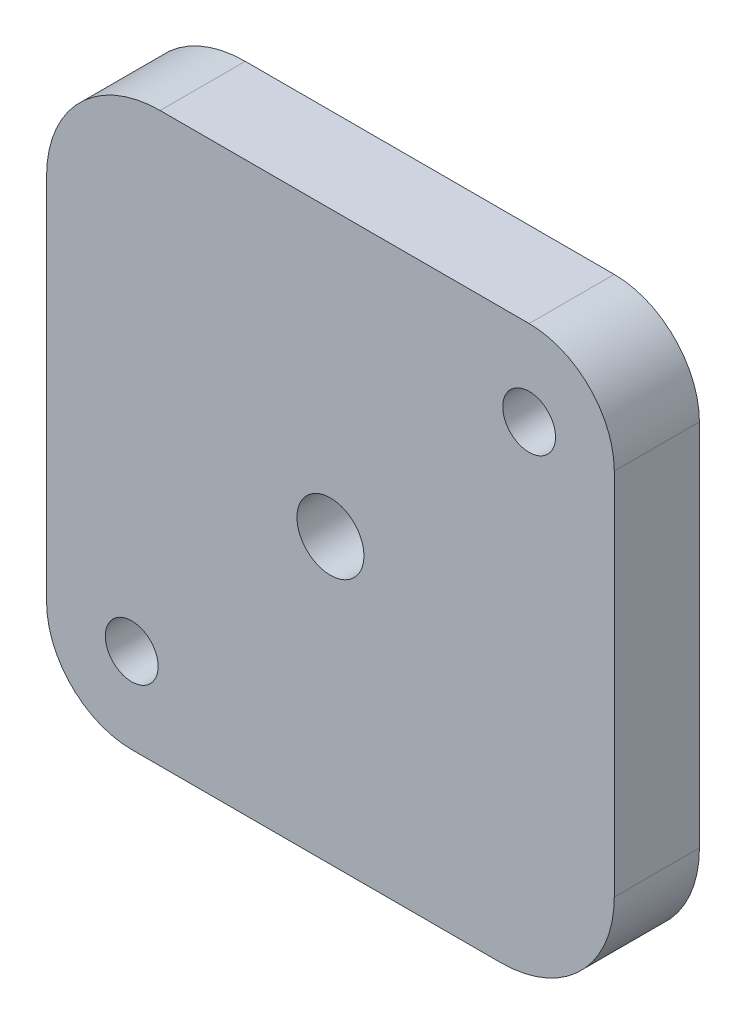
ISO-10303-21;
HEADER;
FILE_DESCRIPTION(('STEP AP214'),'2;1');
FILE_NAME('part.step','',(''),(''),'','','');
FILE_SCHEMA(('AUTOMOTIVE_DESIGN { 1 0 10303 214 1 1 1 1 }'));
ENDSEC;
DATA;
#1=APPLICATION_CONTEXT('core data for automotive mechanical design processes');
#2=APPLICATION_PROTOCOL_DEFINITION('international standard','automotive_design',2000,#1);
#3=PRODUCT_CONTEXT('',#1,'mechanical');
#4=PRODUCT('Part','Part','',(#3));
#5=PRODUCT_RELATED_PRODUCT_CATEGORY('part','',(#4));
#6=PRODUCT_DEFINITION_FORMATION('','',#4);
#7=PRODUCT_DEFINITION_CONTEXT('part definition',#1,'design');
#8=PRODUCT_DEFINITION('design','',#6,#7);
#9=PRODUCT_DEFINITION_SHAPE('','',#8);
#10=(LENGTH_UNIT() NAMED_UNIT(*) SI_UNIT(.MILLI.,.METRE.));
#11=(NAMED_UNIT(*) PLANE_ANGLE_UNIT() SI_UNIT($,.RADIAN.));
#12=(NAMED_UNIT(*) SI_UNIT($,.STERADIAN.) SOLID_ANGLE_UNIT());
#13=UNCERTAINTY_MEASURE_WITH_UNIT(LENGTH_MEASURE(1.E-05),#10,'distance_accuracy_value','');
#14=(GEOMETRIC_REPRESENTATION_CONTEXT(3) GLOBAL_UNCERTAINTY_ASSIGNED_CONTEXT((#13)) GLOBAL_UNIT_ASSIGNED_CONTEXT((#10,
#11,#12)) REPRESENTATION_CONTEXT('',''));
#15=CARTESIAN_POINT('',(0.,0.,0.));
#16=DIRECTION('',(0.,0.,1.));
#17=DIRECTION('',(1.,0.,0.));
#18=AXIS2_PLACEMENT_3D('',#15,#16,#17);
#19=CARTESIAN_POINT('',(-50.,50.,15.));
#20=DIRECTION('',(1.,0.,0.));
#21=DIRECTION('',(0.,1.,0.));
#22=AXIS2_PLACEMENT_3D('',#19,#20,#21);
#23=PLANE('',#22);
#24=DIRECTION('',(0.,-1.,0.));
#25=VECTOR('',#24,1.);
#26=CARTESIAN_POINT('',(-50.,50.,0.));
#27=LINE('',#26,#25);
#28=CARTESIAN_POINT('',(-50.,30.,0.));
#29=VERTEX_POINT('',#28);
#30=CARTESIAN_POINT('',(-50.,-35.,0.));
#31=VERTEX_POINT('',#30);
#32=EDGE_CURVE('E113',#29,#31,#27,.T.);
#33=ORIENTED_EDGE('',*,*,#32,.T.);
#34=DIRECTION('',(0.,0.,-1.));
#35=VECTOR('',#34,1.);
#36=CARTESIAN_POINT('',(-50.,-35.,15.));
#37=LINE('',#36,#35);
#38=CARTESIAN_POINT('',(-50.,-35.,15.));
#39=VERTEX_POINT('',#38);
#40=EDGE_CURVE('E155',#31,#39,#37,.F.);
#41=ORIENTED_EDGE('',*,*,#40,.T.);
#42=DIRECTION('',(0.,-1.,0.));
#43=VECTOR('',#42,1.);
#44=CARTESIAN_POINT('',(-50.,50.,15.));
#45=LINE('',#44,#43);
#46=CARTESIAN_POINT('',(-50.,30.,15.));
#47=VERTEX_POINT('',#46);
#48=EDGE_CURVE('E116',#47,#39,#45,.T.);
#49=ORIENTED_EDGE('',*,*,#48,.F.);
#50=DIRECTION('',(0.,0.,-1.));
#51=VECTOR('',#50,1.);
#52=CARTESIAN_POINT('',(-50.,30.,15.));
#53=LINE('',#52,#51);
#54=EDGE_CURVE('E102',#47,#29,#53,.T.);
#55=ORIENTED_EDGE('',*,*,#54,.T.);
#56=EDGE_LOOP('',(#33,#41,#49,#55));
#57=FACE_BOUND('',#56,.T.);
#58=ADVANCED_FACE('F32',(#57),#23,.F.);
#59=CARTESIAN_POINT('',(50.,-50.,15.));
#60=DIRECTION('',(0.,1.,0.));
#61=DIRECTION('',(-1.,0.,0.));
#62=AXIS2_PLACEMENT_3D('',#59,#60,#61);
#63=PLANE('',#62);
#64=DIRECTION('',(1.,0.,0.));
#65=VECTOR('',#64,1.);
#66=CARTESIAN_POINT('',(50.,-50.,15.));
#67=LINE('',#66,#65);
#68=CARTESIAN_POINT('',(-35.,-50.,15.));
#69=VERTEX_POINT('',#68);
#70=CARTESIAN_POINT('',(30.,-50.,15.));
#71=VERTEX_POINT('',#70);
#72=EDGE_CURVE('E196',#69,#71,#67,.T.);
#73=ORIENTED_EDGE('',*,*,#72,.F.);
#74=DIRECTION('',(0.,0.,-1.));
#75=VECTOR('',#74,1.);
#76=CARTESIAN_POINT('',(-35.,-50.,15.));
#77=LINE('',#76,#75);
#78=CARTESIAN_POINT('',(-35.,-50.,0.));
#79=VERTEX_POINT('',#78);
#80=EDGE_CURVE('E149',#69,#79,#77,.T.);
#81=ORIENTED_EDGE('',*,*,#80,.T.);
#82=DIRECTION('',(1.,0.,0.));
#83=VECTOR('',#82,1.);
#84=CARTESIAN_POINT('',(50.,-50.,0.));
#85=LINE('',#84,#83);
#86=CARTESIAN_POINT('',(30.,-50.,0.));
#87=VERTEX_POINT('',#86);
#88=EDGE_CURVE('E122',#79,#87,#85,.T.);
#89=ORIENTED_EDGE('',*,*,#88,.T.);
#90=DIRECTION('',(0.,0.,-1.));
#91=VECTOR('',#90,1.);
#92=CARTESIAN_POINT('',(30.,-50.,15.));
#93=LINE('',#92,#91);
#94=EDGE_CURVE('E146',#87,#71,#93,.F.);
#95=ORIENTED_EDGE('',*,*,#94,.T.);
#96=EDGE_LOOP('',(#73,#81,#89,#95));
#97=FACE_BOUND('',#96,.T.);
#98=ADVANCED_FACE('F175',(#97),#63,.F.);
#99=CARTESIAN_POINT('',(50.,50.,15.));
#100=DIRECTION('',(-1.,0.,0.));
#101=DIRECTION('',(0.,0.,1.));
#102=AXIS2_PLACEMENT_3D('',#99,#100,#101);
#103=PLANE('',#102);
#104=DIRECTION('',(0.,1.,0.));
#105=VECTOR('',#104,1.);
#106=CARTESIAN_POINT('',(50.,50.,0.));
#107=LINE('',#106,#105);
#108=CARTESIAN_POINT('',(50.,-30.,0.));
#109=VERTEX_POINT('',#108);
#110=CARTESIAN_POINT('',(50.,35.,0.));
#111=VERTEX_POINT('',#110);
#112=EDGE_CURVE('E125',#109,#111,#107,.T.);
#113=ORIENTED_EDGE('',*,*,#112,.T.);
#114=DIRECTION('',(0.,0.,-1.));
#115=VECTOR('',#114,1.);
#116=CARTESIAN_POINT('',(50.,35.,15.));
#117=LINE('',#116,#115);
#118=CARTESIAN_POINT('',(50.,35.,15.));
#119=VERTEX_POINT('',#118);
#120=EDGE_CURVE('E11',#111,#119,#117,.F.);
#121=ORIENTED_EDGE('',*,*,#120,.T.);
#122=DIRECTION('',(0.,1.,0.));
#123=VECTOR('',#122,1.);
#124=CARTESIAN_POINT('',(50.,50.,15.));
#125=LINE('',#124,#123);
#126=CARTESIAN_POINT('',(50.,-30.,15.));
#127=VERTEX_POINT('',#126);
#128=EDGE_CURVE('E194',#127,#119,#125,.T.);
#129=ORIENTED_EDGE('',*,*,#128,.F.);
#130=DIRECTION('',(0.,0.,-1.));
#131=VECTOR('',#130,1.);
#132=CARTESIAN_POINT('',(50.,-30.,15.));
#133=LINE('',#132,#131);
#134=EDGE_CURVE('E143',#127,#109,#133,.T.);
#135=ORIENTED_EDGE('',*,*,#134,.T.);
#136=EDGE_LOOP('',(#113,#121,#129,#135));
#137=FACE_BOUND('',#136,.T.);
#138=ADVANCED_FACE('F165',(#137),#103,.F.);
#139=CARTESIAN_POINT('',(50.,50.,15.));
#140=DIRECTION('',(0.,-1.,0.));
#141=DIRECTION('',(1.,0.,0.));
#142=AXIS2_PLACEMENT_3D('',#139,#140,#141);
#143=PLANE('',#142);
#144=DIRECTION('',(-1.,0.,0.));
#145=VECTOR('',#144,1.);
#146=CARTESIAN_POINT('',(50.,50.,15.));
#147=LINE('',#146,#145);
#148=CARTESIAN_POINT('',(35.,50.,15.));
#149=VERTEX_POINT('',#148);
#150=CARTESIAN_POINT('',(-30.,50.,15.));
#151=VERTEX_POINT('',#150);
#152=EDGE_CURVE('E117',#149,#151,#147,.T.);
#153=ORIENTED_EDGE('',*,*,#152,.F.);
#154=DIRECTION('',(0.,0.,-1.));
#155=VECTOR('',#154,1.);
#156=CARTESIAN_POINT('',(35.,50.,15.));
#157=LINE('',#156,#155);
#158=CARTESIAN_POINT('',(35.,50.,0.));
#159=VERTEX_POINT('',#158);
#160=EDGE_CURVE('E40',#149,#159,#157,.T.);
#161=ORIENTED_EDGE('',*,*,#160,.T.);
#162=DIRECTION('',(-1.,0.,0.));
#163=VECTOR('',#162,1.);
#164=CARTESIAN_POINT('',(50.,50.,0.));
#165=LINE('',#164,#163);
#166=CARTESIAN_POINT('',(-30.,50.,0.));
#167=VERTEX_POINT('',#166);
#168=EDGE_CURVE('E134',#159,#167,#165,.T.);
#169=ORIENTED_EDGE('',*,*,#168,.T.);
#170=DIRECTION('',(0.,0.,-1.));
#171=VECTOR('',#170,1.);
#172=CARTESIAN_POINT('',(-30.,50.,15.));
#173=LINE('',#172,#171);
#174=EDGE_CURVE('E104',#167,#151,#173,.F.);
#175=ORIENTED_EDGE('',*,*,#174,.T.);
#176=EDGE_LOOP('',(#153,#161,#169,#175));
#177=FACE_BOUND('',#176,.T.);
#178=ADVANCED_FACE('F162',(#177),#143,.F.);
#179=CARTESIAN_POINT('',(0.,0.,15.));
#180=DIRECTION('',(0.,0.,-1.));
#181=DIRECTION('',(-1.,0.,0.));
#182=AXIS2_PLACEMENT_3D('',#179,#180,#181);
#183=PLANE('',#182);
#184=CARTESIAN_POINT('',(0.,0.,15.));
#185=DIRECTION('',(0.,0.,1.));
#186=DIRECTION('',(1.,0.,0.));
#187=AXIS2_PLACEMENT_3D('',#184,#185,#186);
#188=CIRCLE('',#187,5.9);
#189=CARTESIAN_POINT('',(5.9,0.,15.));
#190=VERTEX_POINT('',#189);
#191=EDGE_CURVE('E209',#190,#190,#188,.T.);
#192=ORIENTED_EDGE('',*,*,#191,.F.);
#193=EDGE_LOOP('',(#192));
#194=FACE_BOUND('',#193,.T.);
#195=CARTESIAN_POINT('',(-35.,-35.,15.));
#196=DIRECTION('',(0.,0.,1.));
#197=DIRECTION('',(-1.,0.,0.));
#198=AXIS2_PLACEMENT_3D('',#195,#196,#197);
#199=CIRCLE('',#198,4.65);
#200=CARTESIAN_POINT('',(-39.65,-35.,15.));
#201=VERTEX_POINT('',#200);
#202=EDGE_CURVE('E203',#201,#201,#199,.T.);
#203=ORIENTED_EDGE('',*,*,#202,.F.);
#204=EDGE_LOOP('',(#203));
#205=FACE_BOUND('',#204,.T.);
#206=CARTESIAN_POINT('',(35.,35.,15.));
#207=DIRECTION('',(0.,0.,1.));
#208=DIRECTION('',(1.,0.,0.));
#209=AXIS2_PLACEMENT_3D('',#206,#207,#208);
#210=CIRCLE('',#209,4.65);
#211=CARTESIAN_POINT('',(39.65,35.,15.));
#212=VERTEX_POINT('',#211);
#213=EDGE_CURVE('E128',#212,#212,#210,.T.);
#214=ORIENTED_EDGE('',*,*,#213,.F.);
#215=EDGE_LOOP('',(#214));
#216=FACE_BOUND('',#215,.T.);
#217=ORIENTED_EDGE('',*,*,#48,.T.);
#218=CARTESIAN_POINT('',(-35.,-35.,15.));
#219=DIRECTION('',(0.,0.,-1.));
#220=DIRECTION('',(-1.,0.,0.));
#221=AXIS2_PLACEMENT_3D('',#218,#219,#220);
#222=CIRCLE('',#221,15.);
#223=EDGE_CURVE('E158',#39,#69,#222,.F.);
#224=ORIENTED_EDGE('',*,*,#223,.T.);
#225=ORIENTED_EDGE('',*,*,#72,.T.);
#226=CARTESIAN_POINT('',(30.,-30.,15.));
#227=DIRECTION('',(0.,0.,-1.));
#228=DIRECTION('',(-1.,0.,0.));
#229=AXIS2_PLACEMENT_3D('',#226,#227,#228);
#230=CIRCLE('',#229,20.);
#231=EDGE_CURVE('E139',#71,#127,#230,.F.);
#232=ORIENTED_EDGE('',*,*,#231,.T.);
#233=ORIENTED_EDGE('',*,*,#128,.T.);
#234=CARTESIAN_POINT('',(35.,35.,15.));
#235=DIRECTION('',(0.,0.,-1.));
#236=DIRECTION('',(-1.,0.,0.));
#237=AXIS2_PLACEMENT_3D('',#234,#235,#236);
#238=CIRCLE('',#237,15.);
#239=EDGE_CURVE('E52',#119,#149,#238,.F.);
#240=ORIENTED_EDGE('',*,*,#239,.T.);
#241=ORIENTED_EDGE('',*,*,#152,.T.);
#242=CARTESIAN_POINT('',(-30.,30.,15.));
#243=DIRECTION('',(0.,0.,-1.));
#244=DIRECTION('',(-1.,0.,0.));
#245=AXIS2_PLACEMENT_3D('',#242,#243,#244);
#246=CIRCLE('',#245,20.);
#247=EDGE_CURVE('E141',#151,#47,#246,.F.);
#248=ORIENTED_EDGE('',*,*,#247,.T.);
#249=EDGE_LOOP('',(#217,#224,#225,#232,#233,#240,#241,#248));
#250=FACE_BOUND('',#249,.T.);
#251=ADVANCED_FACE('F193',(#194,#205,#216,#250),#183,.F.);
#252=CARTESIAN_POINT('',(0.,0.,0.));
#253=DIRECTION('',(0.,0.,-1.));
#254=DIRECTION('',(-1.,0.,0.));
#255=AXIS2_PLACEMENT_3D('',#252,#253,#254);
#256=PLANE('',#255);
#257=CARTESIAN_POINT('',(0.,0.,0.));
#258=DIRECTION('',(0.,0.,1.));
#259=DIRECTION('',(1.,0.,0.));
#260=AXIS2_PLACEMENT_3D('',#257,#258,#259);
#261=CIRCLE('',#260,5.9);
#262=CARTESIAN_POINT('',(5.9,0.,0.));
#263=VERTEX_POINT('',#262);
#264=EDGE_CURVE('E206',#263,#263,#261,.T.);
#265=ORIENTED_EDGE('',*,*,#264,.T.);
#266=EDGE_LOOP('',(#265));
#267=FACE_BOUND('',#266,.T.);
#268=CARTESIAN_POINT('',(-35.,-35.,0.));
#269=DIRECTION('',(0.,0.,1.));
#270=DIRECTION('',(-1.,0.,0.));
#271=AXIS2_PLACEMENT_3D('',#268,#269,#270);
#272=CIRCLE('',#271,4.65);
#273=CARTESIAN_POINT('',(-39.65,-35.,0.));
#274=VERTEX_POINT('',#273);
#275=EDGE_CURVE('E201',#274,#274,#272,.T.);
#276=ORIENTED_EDGE('',*,*,#275,.T.);
#277=EDGE_LOOP('',(#276));
#278=FACE_BOUND('',#277,.T.);
#279=CARTESIAN_POINT('',(35.,35.,0.));
#280=DIRECTION('',(0.,0.,1.));
#281=DIRECTION('',(1.,0.,0.));
#282=AXIS2_PLACEMENT_3D('',#279,#280,#281);
#283=CIRCLE('',#282,4.65);
#284=CARTESIAN_POINT('',(39.65,35.,0.));
#285=VERTEX_POINT('',#284);
#286=EDGE_CURVE('E123',#285,#285,#283,.T.);
#287=ORIENTED_EDGE('',*,*,#286,.T.);
#288=EDGE_LOOP('',(#287));
#289=FACE_BOUND('',#288,.T.);
#290=ORIENTED_EDGE('',*,*,#88,.F.);
#291=CARTESIAN_POINT('',(-35.,-35.,0.));
#292=DIRECTION('',(0.,0.,-1.));
#293=DIRECTION('',(-1.,0.,0.));
#294=AXIS2_PLACEMENT_3D('',#291,#292,#293);
#295=CIRCLE('',#294,15.);
#296=EDGE_CURVE('E121',#79,#31,#295,.T.);
#297=ORIENTED_EDGE('',*,*,#296,.T.);
#298=ORIENTED_EDGE('',*,*,#32,.F.);
#299=CARTESIAN_POINT('',(-30.,30.,0.));
#300=DIRECTION('',(0.,0.,-1.));
#301=DIRECTION('',(-1.,0.,0.));
#302=AXIS2_PLACEMENT_3D('',#299,#300,#301);
#303=CIRCLE('',#302,20.);
#304=EDGE_CURVE('E98',#29,#167,#303,.T.);
#305=ORIENTED_EDGE('',*,*,#304,.T.);
#306=ORIENTED_EDGE('',*,*,#168,.F.);
#307=CARTESIAN_POINT('',(35.,35.,0.));
#308=DIRECTION('',(0.,0.,-1.));
#309=DIRECTION('',(-1.,0.,0.));
#310=AXIS2_PLACEMENT_3D('',#307,#308,#309);
#311=CIRCLE('',#310,15.);
#312=EDGE_CURVE('E152',#159,#111,#311,.T.);
#313=ORIENTED_EDGE('',*,*,#312,.T.);
#314=ORIENTED_EDGE('',*,*,#112,.F.);
#315=CARTESIAN_POINT('',(30.,-30.,0.));
#316=DIRECTION('',(0.,0.,-1.));
#317=DIRECTION('',(-1.,0.,0.));
#318=AXIS2_PLACEMENT_3D('',#315,#316,#317);
#319=CIRCLE('',#318,20.);
#320=EDGE_CURVE('E108',#109,#87,#319,.T.);
#321=ORIENTED_EDGE('',*,*,#320,.T.);
#322=EDGE_LOOP('',(#290,#297,#298,#305,#306,#313,#314,#321));
#323=FACE_BOUND('',#322,.T.);
#324=ADVANCED_FACE('F120',(#267,#278,#289,#323),#256,.T.);
#325=CARTESIAN_POINT('',(35.,35.,0.));
#326=DIRECTION('',(0.,0.,1.));
#327=DIRECTION('',(1.,0.,0.));
#328=AXIS2_PLACEMENT_3D('',#325,#326,#327);
#329=CYLINDRICAL_SURFACE('',#328,4.65);
#330=ORIENTED_EDGE('',*,*,#286,.F.);
#331=EDGE_LOOP('',(#330));
#332=FACE_BOUND('',#331,.T.);
#333=ORIENTED_EDGE('',*,*,#213,.T.);
#334=EDGE_LOOP('',(#333));
#335=FACE_BOUND('',#334,.T.);
#336=ADVANCED_FACE('F230',(#332,#335),#329,.F.);
#337=CARTESIAN_POINT('',(-35.,-35.,0.));
#338=DIRECTION('',(0.,0.,1.));
#339=DIRECTION('',(1.,0.,0.));
#340=AXIS2_PLACEMENT_3D('',#337,#338,#339);
#341=CYLINDRICAL_SURFACE('',#340,4.65);
#342=ORIENTED_EDGE('',*,*,#275,.F.);
#343=EDGE_LOOP('',(#342));
#344=FACE_BOUND('',#343,.T.);
#345=ORIENTED_EDGE('',*,*,#202,.T.);
#346=EDGE_LOOP('',(#345));
#347=FACE_BOUND('',#346,.T.);
#348=ADVANCED_FACE('F219',(#344,#347),#341,.F.);
#349=CARTESIAN_POINT('',(0.,0.,0.));
#350=DIRECTION('',(0.,0.,1.));
#351=DIRECTION('',(1.,0.,0.));
#352=AXIS2_PLACEMENT_3D('',#349,#350,#351);
#353=CYLINDRICAL_SURFACE('',#352,5.9);
#354=ORIENTED_EDGE('',*,*,#264,.F.);
#355=EDGE_LOOP('',(#354));
#356=FACE_BOUND('',#355,.T.);
#357=ORIENTED_EDGE('',*,*,#191,.T.);
#358=EDGE_LOOP('',(#357));
#359=FACE_BOUND('',#358,.T.);
#360=ADVANCED_FACE('F186',(#356,#359),#353,.F.);
#361=CARTESIAN_POINT('',(-30.,30.,15.));
#362=DIRECTION('',(0.,0.,-1.));
#363=DIRECTION('',(-1.,0.,0.));
#364=AXIS2_PLACEMENT_3D('',#361,#362,#363);
#365=CYLINDRICAL_SURFACE('',#364,20.);
#366=ORIENTED_EDGE('',*,*,#247,.F.);
#367=ORIENTED_EDGE('',*,*,#174,.F.);
#368=ORIENTED_EDGE('',*,*,#304,.F.);
#369=ORIENTED_EDGE('',*,*,#54,.F.);
#370=EDGE_LOOP('',(#366,#367,#368,#369));
#371=FACE_BOUND('',#370,.T.);
#372=ADVANCED_FACE('F101',(#371),#365,.T.);
#373=CARTESIAN_POINT('',(30.,-30.,15.));
#374=DIRECTION('',(0.,0.,-1.));
#375=DIRECTION('',(-1.,0.,0.));
#376=AXIS2_PLACEMENT_3D('',#373,#374,#375);
#377=CYLINDRICAL_SURFACE('',#376,20.);
#378=ORIENTED_EDGE('',*,*,#231,.F.);
#379=ORIENTED_EDGE('',*,*,#94,.F.);
#380=ORIENTED_EDGE('',*,*,#320,.F.);
#381=ORIENTED_EDGE('',*,*,#134,.F.);
#382=EDGE_LOOP('',(#378,#379,#380,#381));
#383=FACE_BOUND('',#382,.T.);
#384=ADVANCED_FACE('F172',(#383),#377,.T.);
#385=CARTESIAN_POINT('',(-35.,-35.,15.));
#386=DIRECTION('',(0.,0.,-1.));
#387=DIRECTION('',(-1.,0.,0.));
#388=AXIS2_PLACEMENT_3D('',#385,#386,#387);
#389=CYLINDRICAL_SURFACE('',#388,15.);
#390=ORIENTED_EDGE('',*,*,#223,.F.);
#391=ORIENTED_EDGE('',*,*,#40,.F.);
#392=ORIENTED_EDGE('',*,*,#296,.F.);
#393=ORIENTED_EDGE('',*,*,#80,.F.);
#394=EDGE_LOOP('',(#390,#391,#392,#393));
#395=FACE_BOUND('',#394,.T.);
#396=ADVANCED_FACE('F168',(#395),#389,.T.);
#397=CARTESIAN_POINT('',(35.,35.,15.));
#398=DIRECTION('',(0.,0.,-1.));
#399=DIRECTION('',(-1.,0.,0.));
#400=AXIS2_PLACEMENT_3D('',#397,#398,#399);
#401=CYLINDRICAL_SURFACE('',#400,15.);
#402=ORIENTED_EDGE('',*,*,#239,.F.);
#403=ORIENTED_EDGE('',*,*,#120,.F.);
#404=ORIENTED_EDGE('',*,*,#312,.F.);
#405=ORIENTED_EDGE('',*,*,#160,.F.);
#406=EDGE_LOOP('',(#402,#403,#404,#405));
#407=FACE_BOUND('',#406,.T.);
#408=ADVANCED_FACE('F34',(#407),#401,.T.);
#409=CLOSED_SHELL('',(#58,#98,#138,#178,#251,#324,#336,#348,#360,#372,#384,#396,#408));
#410=MANIFOLD_SOLID_BREP('B2',#409);
#411=ADVANCED_BREP_SHAPE_REPRESENTATION('',(#18,#410),#14);
#412=SHAPE_DEFINITION_REPRESENTATION(#9,#411);
ENDSEC;
END-ISO-10303-21;
